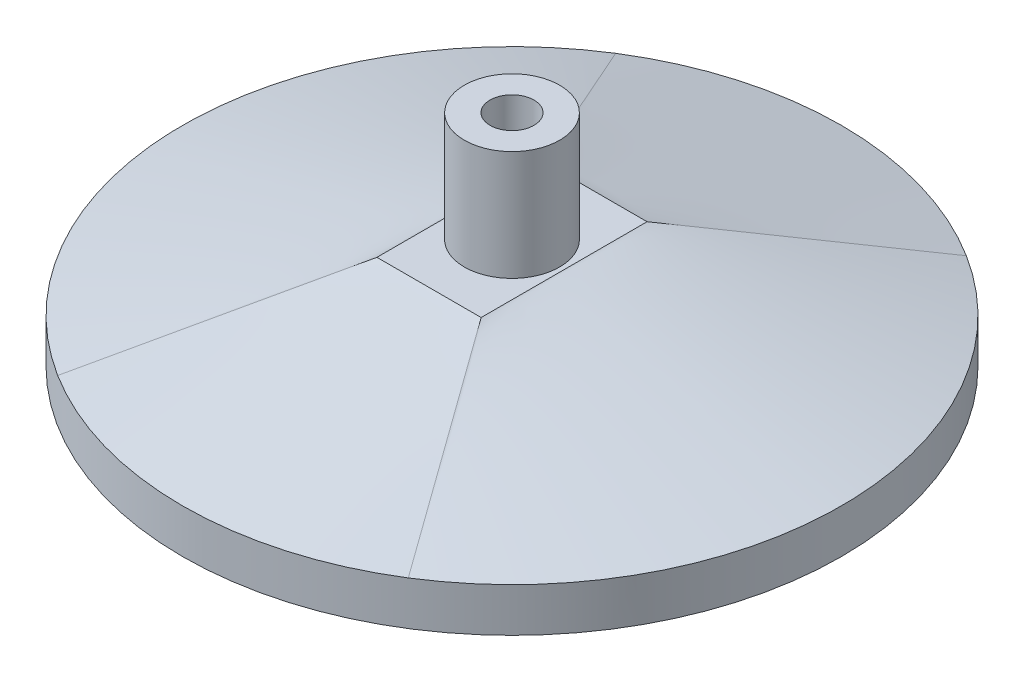
ISO-10303-21;
HEADER;
FILE_DESCRIPTION(('STEP AP214'),'2;1');
FILE_NAME('part.step','',(''),(''),'','','');
FILE_SCHEMA(('AUTOMOTIVE_DESIGN { 1 0 10303 214 1 1 1 1 }'));
ENDSEC;
DATA;
#1=APPLICATION_CONTEXT('core data for automotive mechanical design processes');
#2=APPLICATION_PROTOCOL_DEFINITION('international standard','automotive_design',2000,#1);
#3=PRODUCT_CONTEXT('',#1,'mechanical');
#4=PRODUCT('Part','Part','',(#3));
#5=PRODUCT_RELATED_PRODUCT_CATEGORY('part','',(#4));
#6=PRODUCT_DEFINITION_FORMATION('','',#4);
#7=PRODUCT_DEFINITION_CONTEXT('part definition',#1,'design');
#8=PRODUCT_DEFINITION('design','',#6,#7);
#9=PRODUCT_DEFINITION_SHAPE('','',#8);
#10=(LENGTH_UNIT() NAMED_UNIT(*) SI_UNIT(.MILLI.,.METRE.));
#11=(NAMED_UNIT(*) PLANE_ANGLE_UNIT() SI_UNIT($,.RADIAN.));
#12=(NAMED_UNIT(*) SI_UNIT($,.STERADIAN.) SOLID_ANGLE_UNIT());
#13=UNCERTAINTY_MEASURE_WITH_UNIT(LENGTH_MEASURE(1.E-05),#10,'distance_accuracy_value','');
#14=(GEOMETRIC_REPRESENTATION_CONTEXT(3) GLOBAL_UNCERTAINTY_ASSIGNED_CONTEXT((#13)) GLOBAL_UNIT_ASSIGNED_CONTEXT((#10,
#11,#12)) REPRESENTATION_CONTEXT('',''));
#15=CARTESIAN_POINT('',(0.,0.,0.));
#16=DIRECTION('',(0.,0.,1.));
#17=DIRECTION('',(1.,0.,0.));
#18=AXIS2_PLACEMENT_3D('',#15,#16,#17);
#19=CARTESIAN_POINT('',(0.,2.5,0.));
#20=DIRECTION('',(0.,1.,0.));
#21=DIRECTION('',(0.,0.,1.));
#22=AXIS2_PLACEMENT_3D('',#19,#20,#21);
#23=PLANE('',#22);
#24=CARTESIAN_POINT('',(0.,2.5,0.));
#25=DIRECTION('',(0.,1.,0.));
#26=DIRECTION('',(0.,0.,1.));
#27=AXIS2_PLACEMENT_3D('',#24,#25,#26);
#28=CIRCLE('',#27,1.085);
#29=CARTESIAN_POINT('',(0.,2.5,1.085));
#30=VERTEX_POINT('',#29);
#31=EDGE_CURVE('E12',#30,#30,#28,.T.);
#32=ORIENTED_EDGE('',*,*,#31,.T.);
#33=EDGE_LOOP('',(#32));
#34=FACE_BOUND('',#33,.T.);
#35=CARTESIAN_POINT('',(0.,2.5,0.));
#36=DIRECTION('',(0.,1.,0.));
#37=DIRECTION('',(0.,0.,1.));
#38=AXIS2_PLACEMENT_3D('',#35,#36,#37);
#39=CIRCLE('',#38,0.5);
#40=CARTESIAN_POINT('',(0.,2.5,0.5));
#41=VERTEX_POINT('',#40);
#42=EDGE_CURVE('E80',#41,#41,#39,.T.);
#43=ORIENTED_EDGE('',*,*,#42,.F.);
#44=EDGE_LOOP('',(#43));
#45=FACE_BOUND('',#44,.T.);
#46=ADVANCED_FACE('F69',(#34,#45),#23,.T.);
#47=CARTESIAN_POINT('',(0.,2.5,0.));
#48=DIRECTION('',(0.,-1.,0.));
#49=DIRECTION('',(0.,0.,-1.));
#50=AXIS2_PLACEMENT_3D('',#47,#48,#49);
#51=CYLINDRICAL_SURFACE('',#50,1.085);
#52=ORIENTED_EDGE('',*,*,#31,.F.);
#53=EDGE_LOOP('',(#52));
#54=FACE_BOUND('',#53,.T.);
#55=CARTESIAN_POINT('',(0.,0.,0.));
#56=DIRECTION('',(0.,1.,0.));
#57=DIRECTION('',(0.,0.,1.));
#58=AXIS2_PLACEMENT_3D('',#55,#56,#57);
#59=CIRCLE('',#58,1.085);
#60=CARTESIAN_POINT('',(0.,0.,1.085));
#61=VERTEX_POINT('',#60);
#62=EDGE_CURVE('E127',#61,#61,#59,.T.);
#63=ORIENTED_EDGE('',*,*,#62,.T.);
#64=EDGE_LOOP('',(#63));
#65=FACE_BOUND('',#64,.T.);
#66=ADVANCED_FACE('F71',(#54,#65),#51,.T.);
#67=CARTESIAN_POINT('',(0.,2.5,0.));
#68=DIRECTION('',(0.,-1.,0.));
#69=DIRECTION('',(0.,0.,-1.));
#70=AXIS2_PLACEMENT_3D('',#67,#68,#69);
#71=CYLINDRICAL_SURFACE('',#70,0.5);
#72=ORIENTED_EDGE('',*,*,#42,.T.);
#73=EDGE_LOOP('',(#72));
#74=FACE_BOUND('',#73,.T.);
#75=CARTESIAN_POINT('',(0.,0.,0.));
#76=DIRECTION('',(0.,1.,0.));
#77=DIRECTION('',(0.,0.,1.));
#78=AXIS2_PLACEMENT_3D('',#75,#76,#77);
#79=CIRCLE('',#78,0.5);
#80=CARTESIAN_POINT('',(0.,0.,0.5));
#81=VERTEX_POINT('',#80);
#82=EDGE_CURVE('E206',#81,#81,#79,.T.);
#83=ORIENTED_EDGE('',*,*,#82,.F.);
#84=EDGE_LOOP('',(#83));
#85=FACE_BOUND('',#84,.T.);
#86=ADVANCED_FACE('F186',(#74,#85),#71,.F.);
#87=CARTESIAN_POINT('',(0.,0.,0.));
#88=DIRECTION('',(0.,-1.,0.));
#89=DIRECTION('',(0.,0.,-1.));
#90=AXIS2_PLACEMENT_3D('',#87,#88,#89);
#91=PLANE('',#90);
#92=ORIENTED_EDGE('',*,*,#82,.T.);
#93=EDGE_LOOP('',(#92));
#94=FACE_BOUND('',#93,.T.);
#95=ADVANCED_FACE('F193',(#94),#91,.F.);
#96=ORIENTED_EDGE('',*,*,#62,.F.);
#97=EDGE_LOOP('',(#96));
#98=FACE_BOUND('',#97,.T.);
#99=DIRECTION('',(0.,0.,-1.));
#100=VECTOR('',#99,1.);
#101=CARTESIAN_POINT('',(-1.18652788247661,0.,1.88841761577262));
#102=LINE('',#101,#100);
#103=CARTESIAN_POINT('',(-1.18652788247661,0.,1.88841761577262));
#104=VERTEX_POINT('',#103);
#105=CARTESIAN_POINT('',(-1.18652788247661,0.,-1.88841761577263));
#106=VERTEX_POINT('',#105);
#107=EDGE_CURVE('E216',#104,#106,#102,.T.);
#108=ORIENTED_EDGE('',*,*,#107,.F.);
#109=DIRECTION('',(-1.,0.,0.));
#110=VECTOR('',#109,1.);
#111=CARTESIAN_POINT('',(-1.18652788247661,0.,1.88841761577262));
#112=LINE('',#111,#110);
#113=CARTESIAN_POINT('',(1.18652788247661,0.,1.88841761577262));
#114=VERTEX_POINT('',#113);
#115=EDGE_CURVE('E156',#114,#104,#112,.T.);
#116=ORIENTED_EDGE('',*,*,#115,.F.);
#117=DIRECTION('',(0.,0.,1.));
#118=VECTOR('',#117,1.);
#119=CARTESIAN_POINT('',(1.18652788247661,0.,1.88841761577262));
#120=LINE('',#119,#118);
#121=CARTESIAN_POINT('',(1.18652788247661,0.,-1.88841761577262));
#122=VERTEX_POINT('',#121);
#123=EDGE_CURVE('E144',#122,#114,#120,.T.);
#124=ORIENTED_EDGE('',*,*,#123,.F.);
#125=DIRECTION('',(1.,0.,0.));
#126=VECTOR('',#125,1.);
#127=CARTESIAN_POINT('',(-1.18652788247661,0.,-1.88841761577263));
#128=LINE('',#127,#126);
#129=EDGE_CURVE('E96',#106,#122,#128,.T.);
#130=ORIENTED_EDGE('',*,*,#129,.F.);
#131=EDGE_LOOP('',(#108,#116,#124,#130));
#132=FACE_BOUND('',#131,.T.);
#133=ADVANCED_FACE('F257',(#98,#132),#91,.F.);
#134=CARTESIAN_POINT('',(-1.18652788247661,0.,1.88841761577262));
#135=CARTESIAN_POINT('',(-3.99013557667776,-1.5,6.35049746710684));
#136=CARTESIAN_POINT('',(-1.18652788247661,0.,1.7310494811249));
#137=CARTESIAN_POINT('',(-4.43823355534143,-1.5,6.0689491796279));
#138=CARTESIAN_POINT('',(-1.18652788247661,0.,1.57368134647719));
#139=CARTESIAN_POINT('',(-4.8834399307523,-1.5,5.72272645320454));
#140=CARTESIAN_POINT('',(-1.18652788247661,0.,1.25894507718175));
#141=CARTESIAN_POINT('',(-5.71764060788763,-1.5,4.8893935712425));
#142=CARTESIAN_POINT('',(-1.18652788247661,0.,1.10157694253403));
#143=CARTESIAN_POINT('',(-6.10619327319107,-1.5,4.40186014247168));
#144=CARTESIAN_POINT('',(-1.18652788247661,0.,0.786840673238591));
#145=CARTESIAN_POINT('',(-6.76534367870258,-1.5,3.30031724421815));
#146=CARTESIAN_POINT('',(-1.18652788247661,0.,0.629472538590872));
#147=CARTESIAN_POINT('',(-7.03515812588266,-1.5,2.68628508210353));
#148=CARTESIAN_POINT('',(-1.18652788247661,0.,0.314736269295435));
#149=CARTESIAN_POINT('',(-7.40282004468644,-1.5,1.38124320251482));
#150=CARTESIAN_POINT('',(-1.18652788247661,0.,0.157368134647716));
#151=CARTESIAN_POINT('',(-7.5,-1.5,0.690864070394089));
#152=CARTESIAN_POINT('',(-1.18652788247661,0.,-0.157368134647721));
#153=CARTESIAN_POINT('',(-7.5,-1.5,-0.690864070394095));
#154=CARTESIAN_POINT('',(-1.18652788247661,0.,-0.31473626929544));
#155=CARTESIAN_POINT('',(-7.40282004468644,-1.5,-1.38124320251482));
#156=CARTESIAN_POINT('',(-1.18652788247661,0.,-0.629472538590877));
#157=CARTESIAN_POINT('',(-7.03515812588265,-1.5,-2.68628508210354));
#158=CARTESIAN_POINT('',(-1.18652788247661,0.,-0.786840673238595));
#159=CARTESIAN_POINT('',(-6.76534367870258,-1.5,-3.30031724421815));
#160=CARTESIAN_POINT('',(-1.18652788247661,0.,-1.10157694253403));
#161=CARTESIAN_POINT('',(-6.10619327319107,-1.5,-4.40186014247168));
#162=CARTESIAN_POINT('',(-1.18652788247661,0.,-1.25894507718175));
#163=CARTESIAN_POINT('',(-5.71764060788763,-1.5,-4.8893935712425));
#164=CARTESIAN_POINT('',(-1.18652788247661,0.,-1.57368134647719));
#165=CARTESIAN_POINT('',(-4.88343993075229,-1.5,-5.72272645320455));
#166=CARTESIAN_POINT('',(-1.18652788247661,0.,-1.73104948112491));
#167=CARTESIAN_POINT('',(-4.43823355534142,-1.5,-6.0689491796279));
#168=CARTESIAN_POINT('',(-1.18652788247661,0.,-1.88841761577262));
#169=CARTESIAN_POINT('',(-3.99013557667775,-1.5,-6.35049746710685));
#170=B_SPLINE_SURFACE_WITH_KNOTS('',3,1,((#134,#135),(#136,#137),(#138,#139),(#140,#141),(#142,
#143),(#144,#145),(#146,#147),(#148,#149),(#150,#151),(#152,#153),(#154,#155),(#156,#157),(#158,
#159),(#160,#161),(#162,#163),(#164,#165),(#166,#167),(#168,#169)),.UNSPECIFIED.,.F.,.F.,.F.,(4,
2,2,2,2,2,2,2,4),(2,2),(0.,0.125,0.25,0.375,0.5,0.625,0.75,0.875,1.),(0.,1.),.UNSPECIFIED.);
#171=DIRECTION('',(-0.511692678942984,-0.273768337846275,-0.814384122824751));
#172=VECTOR('',#171,1.);
#173=CARTESIAN_POINT('',(-2.58833172957718,-0.75,-4.11945754143974));
#174=LINE('',#173,#172);
#175=CARTESIAN_POINT('',(-3.99049768271403,-1.5,-6.35107568107875));
#176=VERTEX_POINT('',#175);
#177=EDGE_CURVE('E149',#106,#176,#174,.T.);
#178=CARTESIAN_POINT('',(0.,-1.5,0.));
#179=DIRECTION('',(0.,1.,0.));
#180=DIRECTION('',(0.,0.,1.));
#181=AXIS2_PLACEMENT_3D('',#178,#179,#180);
#182=CIRCLE('',#181,7.5);
#183=CARTESIAN_POINT('',(-3.9904918313569,-1.5,6.35106670749069));
#184=VERTEX_POINT('',#183);
#185=EDGE_CURVE('E73',#176,#184,#182,.T.);
#186=DIRECTION('',(0.511692678942986,0.273768337846275,-0.81438412282475));
#187=VECTOR('',#186,1.);
#188=CARTESIAN_POINT('',(-2.58833172957718,-0.75,4.11945754143973));
#189=LINE('',#188,#187);
#190=EDGE_CURVE('E138',#184,#104,#189,.T.);
#191=ORIENTED_EDGE('',*,*,#107,.T.);
#192=ORIENTED_EDGE('',*,*,#177,.T.);
#193=ORIENTED_EDGE('',*,*,#185,.T.);
#194=ORIENTED_EDGE('',*,*,#190,.T.);
#195=EDGE_LOOP('',(#191,#192,#193,#194));
#196=FACE_BOUND('',#195,.T.);
#197=ADVANCED_FACE('F240',(#196),#170,.T.);
#198=CARTESIAN_POINT('',(-1.18652788247661,0.,-1.88841761577263));
#199=CARTESIAN_POINT('',(-3.99013557667775,-1.5,-6.35049746710685));
#200=CARTESIAN_POINT('',(-0.988773235397171,0.,-1.88841761577263));
#201=CARTESIAN_POINT('',(-3.42703900171986,-1.5,-6.7043015097795));
#202=CARTESIAN_POINT('',(-0.791018588317737,0.,-1.88841761577263));
#203=CARTESIAN_POINT('',(-2.79361860094154,-1.5,-6.99596541617301));
#204=CARTESIAN_POINT('',(-0.395509294158868,0.,-1.88841761577263));
#205=CARTESIAN_POINT('',(-1.43983527330271,-1.5,-7.39423500962531));
#206=CARTESIAN_POINT('',(-0.197754647079434,0.,-1.88841761577262));
#207=CARTESIAN_POINT('',(-0.720215209986826,-1.5,-7.5));
#208=CARTESIAN_POINT('',(0.197754647079435,0.,-1.88841761577262));
#209=CARTESIAN_POINT('',(0.720215209986831,-1.5,-7.5));
#210=CARTESIAN_POINT('',(0.395509294158869,0.,-1.88841761577262));
#211=CARTESIAN_POINT('',(1.43983527330272,-1.5,-7.39423500962531));
#212=CARTESIAN_POINT('',(0.791018588317737,0.,-1.88841761577262));
#213=CARTESIAN_POINT('',(2.79361860094155,-1.5,-6.99596541617301));
#214=CARTESIAN_POINT('',(0.988773235397172,0.,-1.88841761577262));
#215=CARTESIAN_POINT('',(3.42703900171987,-1.5,-6.7043015097795));
#216=CARTESIAN_POINT('',(1.18652788247661,0.,-1.88841761577262));
#217=CARTESIAN_POINT('',(3.99013557667776,-1.5,-6.35049746710684));
#218=B_SPLINE_SURFACE_WITH_KNOTS('',3,1,((#198,#199),(#200,#201),(#202,#203),(#204,#205),(#206,
#207),(#208,#209),(#210,#211),(#212,#213),(#214,#215),(#216,#217)),.UNSPECIFIED.,.F.,.F.,.F.,(4,
2,2,2,4),(2,2),(0.,0.25,0.5,0.75,1.),(0.,1.),.UNSPECIFIED.);
#219=DIRECTION('',(0.511692678942986,-0.273768337846276,-0.81438412282475));
#220=VECTOR('',#219,1.);
#221=CARTESIAN_POINT('',(2.58833172957718,-0.75,-4.11945754143974));
#222=LINE('',#221,#220);
#223=CARTESIAN_POINT('',(3.99049183135683,-1.5,-6.35106670749058));
#224=VERTEX_POINT('',#223);
#225=EDGE_CURVE('E146',#122,#224,#222,.T.);
#226=EDGE_CURVE('E119',#224,#176,#182,.T.);
#227=ORIENTED_EDGE('',*,*,#129,.T.);
#228=ORIENTED_EDGE('',*,*,#225,.T.);
#229=ORIENTED_EDGE('',*,*,#226,.T.);
#230=ORIENTED_EDGE('',*,*,#177,.F.);
#231=EDGE_LOOP('',(#227,#228,#229,#230));
#232=FACE_BOUND('',#231,.T.);
#233=ADVANCED_FACE('F256',(#232),#218,.T.);
#234=CARTESIAN_POINT('',(1.18652788247661,0.,1.88841761577262));
#235=CARTESIAN_POINT('',(3.99013557667776,-1.5,6.35049746710685));
#236=CARTESIAN_POINT('',(0.988773235397172,0.,1.88841761577262));
#237=CARTESIAN_POINT('',(3.42703900171987,-1.5,6.7043015097795));
#238=CARTESIAN_POINT('',(0.791018588317738,0.,1.88841761577262));
#239=CARTESIAN_POINT('',(2.79361860094155,-1.5,6.99596541617301));
#240=CARTESIAN_POINT('',(0.395509294158869,0.,1.88841761577262));
#241=CARTESIAN_POINT('',(1.43983527330272,-1.5,7.39423500962531));
#242=CARTESIAN_POINT('',(0.197754647079435,0.,1.88841761577262));
#243=CARTESIAN_POINT('',(0.720215209986828,-1.5,7.5));
#244=CARTESIAN_POINT('',(-0.197754647079434,0.,1.88841761577262));
#245=CARTESIAN_POINT('',(-0.72021520998683,-1.5,7.5));
#246=CARTESIAN_POINT('',(-0.395509294158868,0.,1.88841761577262));
#247=CARTESIAN_POINT('',(-1.43983527330272,-1.5,7.39423500962531));
#248=CARTESIAN_POINT('',(-0.791018588317737,0.,1.88841761577262));
#249=CARTESIAN_POINT('',(-2.79361860094155,-1.5,6.99596541617301));
#250=CARTESIAN_POINT('',(-0.988773235397171,0.,1.88841761577262));
#251=CARTESIAN_POINT('',(-3.42703900171987,-1.5,6.7043015097795));
#252=CARTESIAN_POINT('',(-1.18652788247661,0.,1.88841761577262));
#253=CARTESIAN_POINT('',(-3.99013557667776,-1.5,6.35049746710684));
#254=B_SPLINE_SURFACE_WITH_KNOTS('',3,1,((#234,#235),(#236,#237),(#238,#239),(#240,#241),(#242,
#243),(#244,#245),(#246,#247),(#248,#249),(#250,#251),(#252,#253)),.UNSPECIFIED.,.F.,.F.,.F.,(4,
2,2,2,4),(2,2),(0.,0.25,0.5,0.75,1.),(0.,1.),.UNSPECIFIED.);
#255=CARTESIAN_POINT('',(3.990497682714,-1.5,6.35107568107869));
#256=VERTEX_POINT('',#255);
#257=EDGE_CURVE('E117',#184,#256,#182,.T.);
#258=DIRECTION('',(0.511692678942985,-0.273768337846275,0.814384122824751));
#259=VECTOR('',#258,1.);
#260=CARTESIAN_POINT('',(2.58833172957718,-0.75,4.11945754143974));
#261=LINE('',#260,#259);
#262=EDGE_CURVE('E137',#114,#256,#261,.T.);
#263=ORIENTED_EDGE('',*,*,#115,.T.);
#264=ORIENTED_EDGE('',*,*,#190,.F.);
#265=ORIENTED_EDGE('',*,*,#257,.T.);
#266=ORIENTED_EDGE('',*,*,#262,.F.);
#267=EDGE_LOOP('',(#263,#264,#265,#266));
#268=FACE_BOUND('',#267,.T.);
#269=ADVANCED_FACE('F136',(#268),#254,.T.);
#270=CARTESIAN_POINT('',(1.18652788247661,0.,-1.88841761577262));
#271=CARTESIAN_POINT('',(3.99013557667776,-1.5,-6.35049746710684));
#272=CARTESIAN_POINT('',(1.18652788247661,0.,-1.73104948112491));
#273=CARTESIAN_POINT('',(4.43823355534143,-1.5,-6.0689491796279));
#274=CARTESIAN_POINT('',(1.18652788247661,0.,-1.57368134647719));
#275=CARTESIAN_POINT('',(4.88343993075229,-1.5,-5.72272645320454));
#276=CARTESIAN_POINT('',(1.18652788247661,0.,-1.25894507718176));
#277=CARTESIAN_POINT('',(5.71764060788763,-1.5,-4.8893935712425));
#278=CARTESIAN_POINT('',(1.18652788247661,0.,-1.10157694253404));
#279=CARTESIAN_POINT('',(6.10619327319107,-1.5,-4.40186014247168));
#280=CARTESIAN_POINT('',(1.18652788247661,0.,-0.786840673238609));
#281=CARTESIAN_POINT('',(6.76534367870258,-1.5,-3.30031724421815));
#282=CARTESIAN_POINT('',(1.18652788247661,0.,-0.629472538590892));
#283=CARTESIAN_POINT('',(7.03515812588265,-1.5,-2.68628508210353));
#284=CARTESIAN_POINT('',(1.18652788247661,0.,-0.314736269295456));
#285=CARTESIAN_POINT('',(7.40282004468644,-1.5,-1.38124320251482));
#286=CARTESIAN_POINT('',(1.18652788247661,0.,-0.157368134647737));
#287=CARTESIAN_POINT('',(7.5,-1.5,-0.69086407039409));
#288=CARTESIAN_POINT('',(1.18652788247661,0.,0.1573681346477));
#289=CARTESIAN_POINT('',(7.5,-1.5,0.690864070394093));
#290=CARTESIAN_POINT('',(1.18652788247661,0.,0.314736269295419));
#291=CARTESIAN_POINT('',(7.40282004468644,-1.5,1.38124320251482));
#292=CARTESIAN_POINT('',(1.18652788247661,0.,0.629472538590858));
#293=CARTESIAN_POINT('',(7.03515812588265,-1.5,2.68628508210353));
#294=CARTESIAN_POINT('',(1.18652788247661,0.,0.786840673238578));
#295=CARTESIAN_POINT('',(6.76534367870258,-1.5,3.30031724421815));
#296=CARTESIAN_POINT('',(1.18652788247661,0.,1.10157694253402));
#297=CARTESIAN_POINT('',(6.10619327319107,-1.5,4.40186014247168));
#298=CARTESIAN_POINT('',(1.18652788247661,0.,1.25894507718174));
#299=CARTESIAN_POINT('',(5.71764060788763,-1.5,4.8893935712425));
#300=CARTESIAN_POINT('',(1.18652788247661,0.,1.57368134647718));
#301=CARTESIAN_POINT('',(4.8834399307523,-1.5,5.72272645320454));
#302=CARTESIAN_POINT('',(1.18652788247661,0.,1.7310494811249));
#303=CARTESIAN_POINT('',(4.43823355534143,-1.5,6.0689491796279));
#304=CARTESIAN_POINT('',(1.18652788247661,0.,1.88841761577262));
#305=CARTESIAN_POINT('',(3.99013557667776,-1.5,6.35049746710685));
#306=B_SPLINE_SURFACE_WITH_KNOTS('',3,1,((#270,#271),(#272,#273),(#274,#275),(#276,#277),(#278,
#279),(#280,#281),(#282,#283),(#284,#285),(#286,#287),(#288,#289),(#290,#291),(#292,#293),(#294,
#295),(#296,#297),(#298,#299),(#300,#301),(#302,#303),(#304,#305)),.UNSPECIFIED.,.F.,.F.,.F.,(4,
2,2,2,2,2,2,2,4),(2,2),(0.,0.125,0.25,0.375,0.5,0.625,0.75,0.875,1.),(0.,1.),.UNSPECIFIED.);
#307=EDGE_CURVE('E113',#256,#224,#182,.T.);
#308=ORIENTED_EDGE('',*,*,#123,.T.);
#309=ORIENTED_EDGE('',*,*,#262,.T.);
#310=ORIENTED_EDGE('',*,*,#307,.T.);
#311=ORIENTED_EDGE('',*,*,#225,.F.);
#312=EDGE_LOOP('',(#308,#309,#310,#311));
#313=FACE_BOUND('',#312,.T.);
#314=ADVANCED_FACE('F143',(#313),#306,.T.);
#315=CARTESIAN_POINT('',(0.,-2.5,0.));
#316=DIRECTION('',(0.,1.,0.));
#317=DIRECTION('',(0.,0.,1.));
#318=AXIS2_PLACEMENT_3D('',#315,#316,#317);
#319=CYLINDRICAL_SURFACE('',#318,7.5);
#320=CARTESIAN_POINT('',(0.,-2.5,0.));
#321=DIRECTION('',(0.,1.,0.));
#322=DIRECTION('',(0.,0.,1.));
#323=AXIS2_PLACEMENT_3D('',#320,#321,#322);
#324=CIRCLE('',#323,7.5);
#325=CARTESIAN_POINT('',(0.,-2.5,7.5));
#326=VERTEX_POINT('',#325);
#327=EDGE_CURVE('E390',#326,#326,#324,.T.);
#328=ORIENTED_EDGE('',*,*,#327,.T.);
#329=EDGE_LOOP('',(#328));
#330=FACE_BOUND('',#329,.T.);
#331=ORIENTED_EDGE('',*,*,#307,.F.);
#332=ORIENTED_EDGE('',*,*,#257,.F.);
#333=ORIENTED_EDGE('',*,*,#185,.F.);
#334=ORIENTED_EDGE('',*,*,#226,.F.);
#335=EDGE_LOOP('',(#331,#332,#333,#334));
#336=FACE_BOUND('',#335,.T.);
#337=ADVANCED_FACE('F116',(#330,#336),#319,.T.);
#338=CARTESIAN_POINT('',(0.,-2.5,0.));
#339=DIRECTION('',(0.,1.,0.));
#340=DIRECTION('',(0.,0.,1.));
#341=AXIS2_PLACEMENT_3D('',#338,#339,#340);
#342=PLANE('',#341);
#343=CARTESIAN_POINT('',(0.,-2.5,0.));
#344=DIRECTION('',(0.,1.,0.));
#345=DIRECTION('',(0.,0.,1.));
#346=AXIS2_PLACEMENT_3D('',#343,#344,#345);
#347=CIRCLE('',#346,6.3228756555323);
#348=CARTESIAN_POINT('',(0.,-2.5,6.3228756555323));
#349=VERTEX_POINT('',#348);
#350=EDGE_CURVE('E219',#349,#349,#347,.T.);
#351=ORIENTED_EDGE('',*,*,#350,.T.);
#352=EDGE_LOOP('',(#351));
#353=FACE_BOUND('',#352,.T.);
#354=ORIENTED_EDGE('',*,*,#327,.F.);
#355=EDGE_LOOP('',(#354));
#356=FACE_BOUND('',#355,.T.);
#357=ADVANCED_FACE('F288',(#353,#356),#342,.F.);
#358=CARTESIAN_POINT('',(0.,-2.,0.));
#359=DIRECTION('',(0.,-1.,0.));
#360=DIRECTION('',(0.,0.,-1.));
#361=AXIS2_PLACEMENT_3D('',#358,#359,#360);
#362=PLANE('',#361);
#363=CARTESIAN_POINT('',(0.,-2.,0.));
#364=DIRECTION('',(0.,-1.,0.));
#365=DIRECTION('',(0.,0.,-1.));
#366=AXIS2_PLACEMENT_3D('',#363,#364,#365);
#367=CIRCLE('',#366,5.);
#368=CARTESIAN_POINT('',(0.,-2.,-5.));
#369=VERTEX_POINT('',#368);
#370=EDGE_CURVE('E388',#369,#369,#367,.T.);
#371=ORIENTED_EDGE('',*,*,#370,.T.);
#372=EDGE_LOOP('',(#371));
#373=FACE_BOUND('',#372,.T.);
#374=ADVANCED_FACE('F296',(#373),#362,.T.);
#375=CARTESIAN_POINT('',(0.,-0.5,0.));
#376=DIRECTION('',(0.,1.,0.));
#377=DIRECTION('',(0.,0.,1.));
#378=AXIS2_PLACEMENT_3D('',#375,#376,#377);
#379=TOROIDAL_SURFACE('',#378,6.3228756555323,2.);
#380=ORIENTED_EDGE('',*,*,#350,.F.);
#381=EDGE_LOOP('',(#380));
#382=FACE_BOUND('',#381,.T.);
#383=ORIENTED_EDGE('',*,*,#370,.F.);
#384=EDGE_LOOP('',(#383));
#385=FACE_BOUND('',#384,.T.);
#386=ADVANCED_FACE('F304',(#382,#385),#379,.T.);
#387=CLOSED_SHELL('',(#46,#66,#86,#95,#133,#197,#233,#269,#314,#337,#357,#374,#386));
#388=MANIFOLD_SOLID_BREP('B2',#387);
#389=ADVANCED_BREP_SHAPE_REPRESENTATION('',(#18,#388),#14);
#390=SHAPE_DEFINITION_REPRESENTATION(#9,#389);
ENDSEC;
END-ISO-10303-21;
